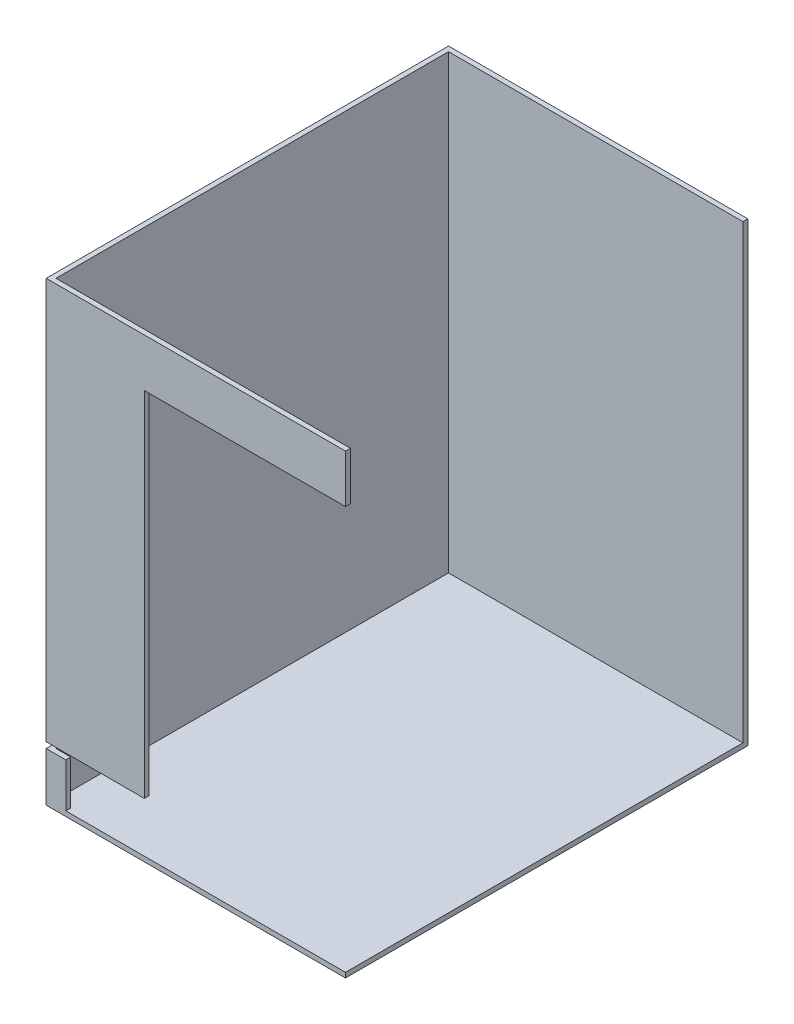
ISO-10303-21;
HEADER;
FILE_DESCRIPTION(('STEP AP214'),'2;1');
FILE_NAME('part.step','',(''),(''),'','','');
FILE_SCHEMA(('AUTOMOTIVE_DESIGN { 1 0 10303 214 1 1 1 1 }'));
ENDSEC;
DATA;
#1=APPLICATION_CONTEXT('core data for automotive mechanical design processes');
#2=APPLICATION_PROTOCOL_DEFINITION('international standard','automotive_design',2000,#1);
#3=PRODUCT_CONTEXT('',#1,'mechanical');
#4=PRODUCT('Part','Part','',(#3));
#5=PRODUCT_RELATED_PRODUCT_CATEGORY('part','',(#4));
#6=PRODUCT_DEFINITION_FORMATION('','',#4);
#7=PRODUCT_DEFINITION_CONTEXT('part definition',#1,'design');
#8=PRODUCT_DEFINITION('design','',#6,#7);
#9=PRODUCT_DEFINITION_SHAPE('','',#8);
#10=(LENGTH_UNIT() NAMED_UNIT(*) SI_UNIT(.MILLI.,.METRE.));
#11=(NAMED_UNIT(*) PLANE_ANGLE_UNIT() SI_UNIT($,.RADIAN.));
#12=(NAMED_UNIT(*) SI_UNIT($,.STERADIAN.) SOLID_ANGLE_UNIT());
#13=UNCERTAINTY_MEASURE_WITH_UNIT(LENGTH_MEASURE(1.E-05),#10,'distance_accuracy_value','');
#14=(GEOMETRIC_REPRESENTATION_CONTEXT(3) GLOBAL_UNCERTAINTY_ASSIGNED_CONTEXT((#13)) GLOBAL_UNIT_ASSIGNED_CONTEXT((#10,
#11,#12)) REPRESENTATION_CONTEXT('',''));
#15=CARTESIAN_POINT('',(0.,0.,0.));
#16=DIRECTION('',(0.,0.,1.));
#17=DIRECTION('',(1.,0.,0.));
#18=AXIS2_PLACEMENT_3D('',#15,#16,#17);
#19=CARTESIAN_POINT('',(0.,230.,202.5));
#20=DIRECTION('',(0.,0.,-1.));
#21=DIRECTION('',(-1.,0.,0.));
#22=AXIS2_PLACEMENT_3D('',#19,#20,#21);
#23=PLANE('',#22);
#24=DIRECTION('',(0.,-1.,0.));
#25=VECTOR('',#24,1.);
#26=CARTESIAN_POINT('',(-2.49999999999998,230.,202.5));
#27=LINE('',#26,#25);
#28=CARTESIAN_POINT('',(-2.49999999999998,230.,202.5));
#29=VERTEX_POINT('',#28);
#30=CARTESIAN_POINT('',(-2.49999999999998,25.5,202.5));
#31=VERTEX_POINT('',#30);
#32=EDGE_CURVE('E282',#29,#31,#27,.T.);
#33=ORIENTED_EDGE('',*,*,#32,.T.);
#34=DIRECTION('',(-1.,0.,0.));
#35=VECTOR('',#34,1.);
#36=CARTESIAN_POINT('',(-2.49999999999998,25.5,202.5));
#37=LINE('',#36,#35);
#38=CARTESIAN_POINT('',(47.5,25.5,202.5));
#39=VERTEX_POINT('',#38);
#40=EDGE_CURVE('E196',#39,#31,#37,.T.);
#41=ORIENTED_EDGE('',*,*,#40,.F.);
#42=DIRECTION('',(0.,-1.,0.));
#43=VECTOR('',#42,1.);
#44=CARTESIAN_POINT('',(47.5,25.5,202.5));
#45=LINE('',#44,#43);
#46=CARTESIAN_POINT('',(47.5,205.5,202.5));
#47=VERTEX_POINT('',#46);
#48=EDGE_CURVE('E210',#47,#39,#45,.T.);
#49=ORIENTED_EDGE('',*,*,#48,.F.);
#50=DIRECTION('',(-1.,0.,0.));
#51=VECTOR('',#50,1.);
#52=CARTESIAN_POINT('',(47.5,205.5,202.5));
#53=LINE('',#52,#51);
#54=CARTESIAN_POINT('',(150.,205.5,202.5));
#55=VERTEX_POINT('',#54);
#56=EDGE_CURVE('E206',#55,#47,#53,.T.);
#57=ORIENTED_EDGE('',*,*,#56,.F.);
#58=DIRECTION('',(0.,-1.,0.));
#59=VECTOR('',#58,1.);
#60=CARTESIAN_POINT('',(150.,230.,202.5));
#61=LINE('',#60,#59);
#62=CARTESIAN_POINT('',(150.,230.,202.5));
#63=VERTEX_POINT('',#62);
#64=EDGE_CURVE('E306',#63,#55,#61,.T.);
#65=ORIENTED_EDGE('',*,*,#64,.F.);
#66=DIRECTION('',(1.,0.,0.));
#67=VECTOR('',#66,1.);
#68=CARTESIAN_POINT('',(0.,230.,202.5));
#69=LINE('',#68,#67);
#70=EDGE_CURVE('E303',#29,#63,#69,.T.);
#71=ORIENTED_EDGE('',*,*,#70,.F.);
#72=EDGE_LOOP('',(#33,#41,#49,#57,#65,#71));
#73=FACE_BOUND('',#72,.T.);
#74=ADVANCED_FACE('F41',(#73),#23,.F.);
#75=CARTESIAN_POINT('',(150.,230.,0.));
#76=DIRECTION('',(-1.,0.,0.));
#77=DIRECTION('',(0.,0.,1.));
#78=AXIS2_PLACEMENT_3D('',#75,#76,#77);
#79=PLANE('',#78);
#80=ORIENTED_EDGE('',*,*,#64,.T.);
#81=DIRECTION('',(0.,0.,1.));
#82=VECTOR('',#81,1.);
#83=CARTESIAN_POINT('',(150.,205.5,199.5));
#84=LINE('',#83,#82);
#85=CARTESIAN_POINT('',(150.,205.5,200.));
#86=VERTEX_POINT('',#85);
#87=EDGE_CURVE('E227',#86,#55,#84,.T.);
#88=ORIENTED_EDGE('',*,*,#87,.F.);
#89=DIRECTION('',(0.,-1.,0.));
#90=VECTOR('',#89,1.);
#91=CARTESIAN_POINT('',(150.,230.,200.));
#92=LINE('',#91,#90);
#93=CARTESIAN_POINT('',(150.,230.,200.));
#94=VERTEX_POINT('',#93);
#95=EDGE_CURVE('E262',#94,#86,#92,.T.);
#96=ORIENTED_EDGE('',*,*,#95,.F.);
#97=DIRECTION('',(0.,0.,-1.));
#98=VECTOR('',#97,1.);
#99=CARTESIAN_POINT('',(150.,230.,0.));
#100=LINE('',#99,#98);
#101=EDGE_CURVE('E272',#63,#94,#100,.T.);
#102=ORIENTED_EDGE('',*,*,#101,.F.);
#103=EDGE_LOOP('',(#80,#88,#96,#102));
#104=FACE_BOUND('',#103,.T.);
#105=ADVANCED_FACE('F383',(#104),#79,.F.);
#106=CARTESIAN_POINT('',(0.,230.,200.));
#107=DIRECTION('',(0.,0.,-1.));
#108=DIRECTION('',(-1.,0.,0.));
#109=AXIS2_PLACEMENT_3D('',#106,#107,#108);
#110=PLANE('',#109);
#111=DIRECTION('',(1.,0.,0.));
#112=VECTOR('',#111,1.);
#113=CARTESIAN_POINT('',(0.,25.5,200.));
#114=LINE('',#113,#112);
#115=CARTESIAN_POINT('',(0.,25.5,200.));
#116=VERTEX_POINT('',#115);
#117=CARTESIAN_POINT('',(47.5,25.5,200.));
#118=VERTEX_POINT('',#117);
#119=EDGE_CURVE('E325',#116,#118,#114,.T.);
#120=ORIENTED_EDGE('',*,*,#119,.F.);
#121=DIRECTION('',(0.,-1.,0.));
#122=VECTOR('',#121,1.);
#123=CARTESIAN_POINT('',(0.,230.,200.));
#124=LINE('',#123,#122);
#125=CARTESIAN_POINT('',(0.,230.,200.));
#126=VERTEX_POINT('',#125);
#127=EDGE_CURVE('E267',#126,#116,#124,.T.);
#128=ORIENTED_EDGE('',*,*,#127,.F.);
#129=DIRECTION('',(1.,0.,0.));
#130=VECTOR('',#129,1.);
#131=CARTESIAN_POINT('',(0.,230.,200.));
#132=LINE('',#131,#130);
#133=EDGE_CURVE('E241',#126,#94,#132,.T.);
#134=ORIENTED_EDGE('',*,*,#133,.T.);
#135=ORIENTED_EDGE('',*,*,#95,.T.);
#136=DIRECTION('',(1.,0.,0.));
#137=VECTOR('',#136,1.);
#138=CARTESIAN_POINT('',(0.,205.5,200.));
#139=LINE('',#138,#137);
#140=CARTESIAN_POINT('',(47.5,205.5,200.));
#141=VERTEX_POINT('',#140);
#142=EDGE_CURVE('E319',#141,#86,#139,.T.);
#143=ORIENTED_EDGE('',*,*,#142,.F.);
#144=DIRECTION('',(0.,1.,0.));
#145=VECTOR('',#144,1.);
#146=CARTESIAN_POINT('',(47.5,230.,200.));
#147=LINE('',#146,#145);
#148=EDGE_CURVE('E322',#118,#141,#147,.T.);
#149=ORIENTED_EDGE('',*,*,#148,.F.);
#150=EDGE_LOOP('',(#120,#128,#134,#135,#143,#149));
#151=FACE_BOUND('',#150,.T.);
#152=ADVANCED_FACE('F375',(#151),#110,.T.);
#153=CARTESIAN_POINT('',(-2.5,230.,0.));
#154=DIRECTION('',(1.,0.,0.));
#155=DIRECTION('',(0.,0.,-1.));
#156=AXIS2_PLACEMENT_3D('',#153,#154,#155);
#157=PLANE('',#156);
#158=DIRECTION('',(0.,-1.,0.));
#159=VECTOR('',#158,1.);
#160=CARTESIAN_POINT('',(-2.49999999999998,25.5,199.5));
#161=LINE('',#160,#159);
#162=CARTESIAN_POINT('',(-2.49999999999998,25.5,199.5));
#163=VERTEX_POINT('',#162);
#164=CARTESIAN_POINT('',(-2.49999999999998,22.5,199.5));
#165=VERTEX_POINT('',#164);
#166=EDGE_CURVE('E191',#163,#165,#161,.T.);
#167=ORIENTED_EDGE('',*,*,#166,.F.);
#168=DIRECTION('',(0.,0.,1.));
#169=VECTOR('',#168,1.);
#170=CARTESIAN_POINT('',(-2.49999999999998,25.5,199.5));
#171=LINE('',#170,#169);
#172=EDGE_CURVE('E216',#163,#31,#171,.T.);
#173=ORIENTED_EDGE('',*,*,#172,.T.);
#174=ORIENTED_EDGE('',*,*,#32,.F.);
#175=DIRECTION('',(0.,0.,1.));
#176=VECTOR('',#175,1.);
#177=CARTESIAN_POINT('',(-2.5,230.,0.));
#178=LINE('',#177,#176);
#179=CARTESIAN_POINT('',(-2.5,230.,-2.5));
#180=VERTEX_POINT('',#179);
#181=EDGE_CURVE('E299',#180,#29,#178,.T.);
#182=ORIENTED_EDGE('',*,*,#181,.F.);
#183=DIRECTION('',(0.,-1.,0.));
#184=VECTOR('',#183,1.);
#185=CARTESIAN_POINT('',(-2.5,230.,-2.5));
#186=LINE('',#185,#184);
#187=CARTESIAN_POINT('',(-2.5,-2.5,-2.5));
#188=VERTEX_POINT('',#187);
#189=EDGE_CURVE('E288',#180,#188,#186,.T.);
#190=ORIENTED_EDGE('',*,*,#189,.T.);
#191=DIRECTION('',(0.,0.,1.));
#192=VECTOR('',#191,1.);
#193=CARTESIAN_POINT('',(-2.5,-2.5,0.));
#194=LINE('',#193,#192);
#195=CARTESIAN_POINT('',(-2.49999999999998,-2.5,202.5));
#196=VERTEX_POINT('',#195);
#197=EDGE_CURVE('E271',#188,#196,#194,.T.);
#198=ORIENTED_EDGE('',*,*,#197,.T.);
#199=CARTESIAN_POINT('',(-2.49999999999998,22.5,202.5));
#200=VERTEX_POINT('',#199);
#201=EDGE_CURVE('E287',#200,#196,#27,.T.);
#202=ORIENTED_EDGE('',*,*,#201,.F.);
#203=DIRECTION('',(0.,0.,1.));
#204=VECTOR('',#203,1.);
#205=CARTESIAN_POINT('',(-2.49999999999998,22.5,199.5));
#206=LINE('',#205,#204);
#207=EDGE_CURVE('E203',#165,#200,#206,.T.);
#208=ORIENTED_EDGE('',*,*,#207,.F.);
#209=EDGE_LOOP('',(#167,#173,#174,#182,#190,#198,#202,#208));
#210=FACE_BOUND('',#209,.T.);
#211=ADVANCED_FACE('F345',(#210),#157,.F.);
#212=DIRECTION('',(1.,0.,0.));
#213=VECTOR('',#212,1.);
#214=CARTESIAN_POINT('',(7.50000000000003,0.,202.5));
#215=LINE('',#214,#213);
#216=CARTESIAN_POINT('',(7.50000000000003,0.,202.5));
#217=VERTEX_POINT('',#216);
#218=CARTESIAN_POINT('',(150.,0.,202.5));
#219=VERTEX_POINT('',#218);
#220=EDGE_CURVE('E165',#217,#219,#215,.T.);
#221=ORIENTED_EDGE('',*,*,#220,.F.);
#222=DIRECTION('',(0.,-1.,0.));
#223=VECTOR('',#222,1.);
#224=CARTESIAN_POINT('',(7.50000000000002,22.5,202.5));
#225=LINE('',#224,#223);
#226=CARTESIAN_POINT('',(7.50000000000002,22.5,202.5));
#227=VERTEX_POINT('',#226);
#228=EDGE_CURVE('E173',#227,#217,#225,.T.);
#229=ORIENTED_EDGE('',*,*,#228,.F.);
#230=DIRECTION('',(1.,0.,0.));
#231=VECTOR('',#230,1.);
#232=CARTESIAN_POINT('',(-2.49999999999998,22.5,202.5));
#233=LINE('',#232,#231);
#234=EDGE_CURVE('E190',#200,#227,#233,.T.);
#235=ORIENTED_EDGE('',*,*,#234,.F.);
#236=ORIENTED_EDGE('',*,*,#201,.T.);
#237=DIRECTION('',(1.,0.,0.));
#238=VECTOR('',#237,1.);
#239=CARTESIAN_POINT('',(0.,-2.5,202.5));
#240=LINE('',#239,#238);
#241=CARTESIAN_POINT('',(150.,-2.5,202.5));
#242=VERTEX_POINT('',#241);
#243=EDGE_CURVE('E281',#196,#242,#240,.T.);
#244=ORIENTED_EDGE('',*,*,#243,.T.);
#245=EDGE_CURVE('E182',#219,#242,#61,.T.);
#246=ORIENTED_EDGE('',*,*,#245,.F.);
#247=EDGE_LOOP('',(#221,#229,#235,#236,#244,#246));
#248=FACE_BOUND('',#247,.T.);
#249=ADVANCED_FACE('F180',(#248),#23,.F.);
#250=DIRECTION('',(0.,0.,-1.));
#251=VECTOR('',#250,1.);
#252=CARTESIAN_POINT('',(150.,0.,0.));
#253=LINE('',#252,#251);
#254=CARTESIAN_POINT('',(150.,0.,0.));
#255=VERTEX_POINT('',#254);
#256=EDGE_CURVE('E253',#219,#255,#253,.T.);
#257=ORIENTED_EDGE('',*,*,#256,.F.);
#258=ORIENTED_EDGE('',*,*,#245,.T.);
#259=DIRECTION('',(0.,0.,-1.));
#260=VECTOR('',#259,1.);
#261=CARTESIAN_POINT('',(150.,-2.5,0.));
#262=LINE('',#261,#260);
#263=CARTESIAN_POINT('',(150.,-2.5,-2.5));
#264=VERTEX_POINT('',#263);
#265=EDGE_CURVE('E295',#242,#264,#262,.T.);
#266=ORIENTED_EDGE('',*,*,#265,.T.);
#267=DIRECTION('',(0.,-1.,0.));
#268=VECTOR('',#267,1.);
#269=CARTESIAN_POINT('',(150.,230.,-2.5));
#270=LINE('',#269,#268);
#271=CARTESIAN_POINT('',(150.,230.,-2.5));
#272=VERTEX_POINT('',#271);
#273=EDGE_CURVE('E292',#272,#264,#270,.T.);
#274=ORIENTED_EDGE('',*,*,#273,.F.);
#275=CARTESIAN_POINT('',(150.,230.,0.));
#276=VERTEX_POINT('',#275);
#277=EDGE_CURVE('E277',#276,#272,#100,.T.);
#278=ORIENTED_EDGE('',*,*,#277,.F.);
#279=DIRECTION('',(0.,-1.,0.));
#280=VECTOR('',#279,1.);
#281=CARTESIAN_POINT('',(150.,230.,0.));
#282=LINE('',#281,#280);
#283=EDGE_CURVE('E64',#276,#255,#282,.T.);
#284=ORIENTED_EDGE('',*,*,#283,.T.);
#285=EDGE_LOOP('',(#257,#258,#266,#274,#278,#284));
#286=FACE_BOUND('',#285,.T.);
#287=ADVANCED_FACE('F363',(#286),#79,.F.);
#288=CARTESIAN_POINT('',(0.,230.,-2.5));
#289=DIRECTION('',(0.,0.,1.));
#290=DIRECTION('',(1.,0.,0.));
#291=AXIS2_PLACEMENT_3D('',#288,#289,#290);
#292=PLANE('',#291);
#293=DIRECTION('',(-1.,0.,0.));
#294=VECTOR('',#293,1.);
#295=CARTESIAN_POINT('',(0.,-2.5,-2.5));
#296=LINE('',#295,#294);
#297=EDGE_CURVE('E296',#264,#188,#296,.T.);
#298=ORIENTED_EDGE('',*,*,#297,.T.);
#299=ORIENTED_EDGE('',*,*,#189,.F.);
#300=DIRECTION('',(-1.,0.,0.));
#301=VECTOR('',#300,1.);
#302=CARTESIAN_POINT('',(0.,230.,-2.5));
#303=LINE('',#302,#301);
#304=EDGE_CURVE('E276',#272,#180,#303,.T.);
#305=ORIENTED_EDGE('',*,*,#304,.F.);
#306=ORIENTED_EDGE('',*,*,#273,.T.);
#307=EDGE_LOOP('',(#298,#299,#305,#306));
#308=FACE_BOUND('',#307,.T.);
#309=ADVANCED_FACE('F359',(#308),#292,.F.);
#310=CARTESIAN_POINT('',(0.,230.,0.));
#311=DIRECTION('',(0.,1.,0.));
#312=DIRECTION('',(0.,0.,1.));
#313=AXIS2_PLACEMENT_3D('',#310,#311,#312);
#314=PLANE('',#313);
#315=ORIENTED_EDGE('',*,*,#133,.F.);
#316=DIRECTION('',(0.,0.,1.));
#317=VECTOR('',#316,1.);
#318=CARTESIAN_POINT('',(0.,230.,0.));
#319=LINE('',#318,#317);
#320=CARTESIAN_POINT('',(0.,230.,0.));
#321=VERTEX_POINT('',#320);
#322=EDGE_CURVE('E238',#321,#126,#319,.T.);
#323=ORIENTED_EDGE('',*,*,#322,.F.);
#324=DIRECTION('',(-1.,0.,0.));
#325=VECTOR('',#324,1.);
#326=CARTESIAN_POINT('',(0.,230.,0.));
#327=LINE('',#326,#325);
#328=EDGE_CURVE('E245',#276,#321,#327,.T.);
#329=ORIENTED_EDGE('',*,*,#328,.F.);
#330=ORIENTED_EDGE('',*,*,#277,.T.);
#331=ORIENTED_EDGE('',*,*,#304,.T.);
#332=ORIENTED_EDGE('',*,*,#181,.T.);
#333=ORIENTED_EDGE('',*,*,#70,.T.);
#334=ORIENTED_EDGE('',*,*,#101,.T.);
#335=EDGE_LOOP('',(#315,#323,#329,#330,#331,#332,#333,#334));
#336=FACE_BOUND('',#335,.T.);
#337=ADVANCED_FACE('F402',(#336),#314,.T.);
#338=CARTESIAN_POINT('',(0.,-2.5,0.));
#339=DIRECTION('',(0.,1.,0.));
#340=DIRECTION('',(0.,0.,1.));
#341=AXIS2_PLACEMENT_3D('',#338,#339,#340);
#342=PLANE('',#341);
#343=ORIENTED_EDGE('',*,*,#197,.F.);
#344=ORIENTED_EDGE('',*,*,#297,.F.);
#345=ORIENTED_EDGE('',*,*,#265,.F.);
#346=ORIENTED_EDGE('',*,*,#243,.F.);
#347=EDGE_LOOP('',(#343,#344,#345,#346));
#348=FACE_BOUND('',#347,.T.);
#349=ADVANCED_FACE('F43',(#348),#342,.F.);
#350=CARTESIAN_POINT('',(0.,230.,0.));
#351=DIRECTION('',(1.,0.,0.));
#352=DIRECTION('',(0.,0.,-1.));
#353=AXIS2_PLACEMENT_3D('',#350,#351,#352);
#354=PLANE('',#353);
#355=DIRECTION('',(0.,0.,1.));
#356=VECTOR('',#355,1.);
#357=CARTESIAN_POINT('',(0.,25.5,0.));
#358=LINE('',#357,#356);
#359=CARTESIAN_POINT('',(0.,25.5,199.5));
#360=VERTEX_POINT('',#359);
#361=EDGE_CURVE('E234',#360,#116,#358,.T.);
#362=ORIENTED_EDGE('',*,*,#361,.F.);
#363=DIRECTION('',(0.,-1.,0.));
#364=VECTOR('',#363,1.);
#365=CARTESIAN_POINT('',(0.,230.,199.5));
#366=LINE('',#365,#364);
#367=CARTESIAN_POINT('',(0.,22.5,199.5));
#368=VERTEX_POINT('',#367);
#369=EDGE_CURVE('E50',#360,#368,#366,.T.);
#370=ORIENTED_EDGE('',*,*,#369,.T.);
#371=DIRECTION('',(0.,0.,-1.));
#372=VECTOR('',#371,1.);
#373=CARTESIAN_POINT('',(0.,22.5,0.));
#374=LINE('',#373,#372);
#375=CARTESIAN_POINT('',(0.,22.5,200.));
#376=VERTEX_POINT('',#375);
#377=EDGE_CURVE('E220',#376,#368,#374,.T.);
#378=ORIENTED_EDGE('',*,*,#377,.F.);
#379=CARTESIAN_POINT('',(0.,0.,200.));
#380=VERTEX_POINT('',#379);
#381=EDGE_CURVE('E266',#376,#380,#124,.T.);
#382=ORIENTED_EDGE('',*,*,#381,.T.);
#383=DIRECTION('',(0.,0.,1.));
#384=VECTOR('',#383,1.);
#385=CARTESIAN_POINT('',(0.,0.,0.));
#386=LINE('',#385,#384);
#387=CARTESIAN_POINT('',(0.,0.,0.));
#388=VERTEX_POINT('',#387);
#389=EDGE_CURVE('E237',#388,#380,#386,.T.);
#390=ORIENTED_EDGE('',*,*,#389,.F.);
#391=DIRECTION('',(0.,-1.,0.));
#392=VECTOR('',#391,1.);
#393=CARTESIAN_POINT('',(0.,230.,0.));
#394=LINE('',#393,#392);
#395=EDGE_CURVE('E248',#321,#388,#394,.T.);
#396=ORIENTED_EDGE('',*,*,#395,.F.);
#397=ORIENTED_EDGE('',*,*,#322,.T.);
#398=ORIENTED_EDGE('',*,*,#127,.T.);
#399=EDGE_LOOP('',(#362,#370,#378,#382,#390,#396,#397,#398));
#400=FACE_BOUND('',#399,.T.);
#401=ADVANCED_FACE('F331',(#400),#354,.T.);
#402=DIRECTION('',(0.,1.,0.));
#403=VECTOR('',#402,1.);
#404=CARTESIAN_POINT('',(7.5,230.,200.));
#405=LINE('',#404,#403);
#406=CARTESIAN_POINT('',(7.50000000000003,0.,200.));
#407=VERTEX_POINT('',#406);
#408=CARTESIAN_POINT('',(7.50000000000002,22.5,200.));
#409=VERTEX_POINT('',#408);
#410=EDGE_CURVE('E57',#407,#409,#405,.T.);
#411=ORIENTED_EDGE('',*,*,#410,.F.);
#412=DIRECTION('',(1.,0.,0.));
#413=VECTOR('',#412,1.);
#414=CARTESIAN_POINT('',(0.,0.,200.));
#415=LINE('',#414,#413);
#416=EDGE_CURVE('E169',#380,#407,#415,.T.);
#417=ORIENTED_EDGE('',*,*,#416,.F.);
#418=ORIENTED_EDGE('',*,*,#381,.F.);
#419=DIRECTION('',(-1.,0.,0.));
#420=VECTOR('',#419,1.);
#421=CARTESIAN_POINT('',(0.,22.5,200.));
#422=LINE('',#421,#420);
#423=EDGE_CURVE('E286',#409,#376,#422,.T.);
#424=ORIENTED_EDGE('',*,*,#423,.F.);
#425=EDGE_LOOP('',(#411,#417,#418,#424));
#426=FACE_BOUND('',#425,.T.);
#427=ADVANCED_FACE('F372',(#426),#110,.T.);
#428=CARTESIAN_POINT('',(0.,230.,0.));
#429=DIRECTION('',(0.,0.,1.));
#430=DIRECTION('',(1.,0.,0.));
#431=AXIS2_PLACEMENT_3D('',#428,#429,#430);
#432=PLANE('',#431);
#433=DIRECTION('',(-1.,0.,0.));
#434=VECTOR('',#433,1.);
#435=CARTESIAN_POINT('',(0.,0.,0.));
#436=LINE('',#435,#434);
#437=EDGE_CURVE('E242',#255,#388,#436,.T.);
#438=ORIENTED_EDGE('',*,*,#437,.F.);
#439=ORIENTED_EDGE('',*,*,#283,.F.);
#440=ORIENTED_EDGE('',*,*,#328,.T.);
#441=ORIENTED_EDGE('',*,*,#395,.T.);
#442=EDGE_LOOP('',(#438,#439,#440,#441));
#443=FACE_BOUND('',#442,.T.);
#444=ADVANCED_FACE('F365',(#443),#432,.T.);
#445=CARTESIAN_POINT('',(0.,0.,0.));
#446=DIRECTION('',(0.,1.,0.));
#447=DIRECTION('',(0.,0.,1.));
#448=AXIS2_PLACEMENT_3D('',#445,#446,#447);
#449=PLANE('',#448);
#450=ORIENTED_EDGE('',*,*,#416,.T.);
#451=DIRECTION('',(0.,0.,1.));
#452=VECTOR('',#451,1.);
#453=CARTESIAN_POINT('',(7.50000000000003,0.,172.5));
#454=LINE('',#453,#452);
#455=EDGE_CURVE('E161',#407,#217,#454,.T.);
#456=ORIENTED_EDGE('',*,*,#455,.T.);
#457=ORIENTED_EDGE('',*,*,#220,.T.);
#458=ORIENTED_EDGE('',*,*,#256,.T.);
#459=ORIENTED_EDGE('',*,*,#437,.T.);
#460=ORIENTED_EDGE('',*,*,#389,.T.);
#461=EDGE_LOOP('',(#450,#456,#457,#458,#459,#460));
#462=FACE_BOUND('',#461,.T.);
#463=ADVANCED_FACE('F163',(#462),#449,.T.);
#464=CARTESIAN_POINT('',(-2.49999999999998,25.5,199.5));
#465=DIRECTION('',(0.,1.,0.));
#466=DIRECTION('',(0.,0.,1.));
#467=AXIS2_PLACEMENT_3D('',#464,#465,#466);
#468=PLANE('',#467);
#469=ORIENTED_EDGE('',*,*,#361,.T.);
#470=ORIENTED_EDGE('',*,*,#119,.T.);
#471=DIRECTION('',(0.,0.,1.));
#472=VECTOR('',#471,1.);
#473=CARTESIAN_POINT('',(47.5,25.5,199.5));
#474=LINE('',#473,#472);
#475=EDGE_CURVE('E221',#118,#39,#474,.T.);
#476=ORIENTED_EDGE('',*,*,#475,.T.);
#477=ORIENTED_EDGE('',*,*,#40,.T.);
#478=ORIENTED_EDGE('',*,*,#172,.F.);
#479=DIRECTION('',(-1.,0.,0.));
#480=VECTOR('',#479,1.);
#481=CARTESIAN_POINT('',(-2.49999999999998,25.5,199.5));
#482=LINE('',#481,#480);
#483=EDGE_CURVE('E200',#360,#163,#482,.T.);
#484=ORIENTED_EDGE('',*,*,#483,.F.);
#485=EDGE_LOOP('',(#469,#470,#476,#477,#478,#484));
#486=FACE_BOUND('',#485,.T.);
#487=ADVANCED_FACE('F338',(#486),#468,.F.);
#488=CARTESIAN_POINT('',(47.5,25.5,199.5));
#489=DIRECTION('',(-1.,0.,0.));
#490=DIRECTION('',(0.,0.,1.));
#491=AXIS2_PLACEMENT_3D('',#488,#489,#490);
#492=PLANE('',#491);
#493=ORIENTED_EDGE('',*,*,#148,.T.);
#494=DIRECTION('',(0.,0.,1.));
#495=VECTOR('',#494,1.);
#496=CARTESIAN_POINT('',(47.5,205.5,199.5));
#497=LINE('',#496,#495);
#498=EDGE_CURVE('E224',#141,#47,#497,.T.);
#499=ORIENTED_EDGE('',*,*,#498,.T.);
#500=ORIENTED_EDGE('',*,*,#48,.T.);
#501=ORIENTED_EDGE('',*,*,#475,.F.);
#502=EDGE_LOOP('',(#493,#499,#500,#501));
#503=FACE_BOUND('',#502,.T.);
#504=ADVANCED_FACE('F423',(#503),#492,.F.);
#505=CARTESIAN_POINT('',(47.5,205.5,199.5));
#506=DIRECTION('',(0.,1.,0.));
#507=DIRECTION('',(0.,0.,1.));
#508=AXIS2_PLACEMENT_3D('',#505,#506,#507);
#509=PLANE('',#508);
#510=ORIENTED_EDGE('',*,*,#142,.T.);
#511=ORIENTED_EDGE('',*,*,#87,.T.);
#512=ORIENTED_EDGE('',*,*,#56,.T.);
#513=ORIENTED_EDGE('',*,*,#498,.F.);
#514=EDGE_LOOP('',(#510,#511,#512,#513));
#515=FACE_BOUND('',#514,.T.);
#516=ADVANCED_FACE('F418',(#515),#509,.F.);
#517=CARTESIAN_POINT('',(-2.49999999999998,22.5,199.5));
#518=DIRECTION('',(0.,-1.,0.));
#519=DIRECTION('',(1.,0.,0.));
#520=AXIS2_PLACEMENT_3D('',#517,#518,#519);
#521=PLANE('',#520);
#522=ORIENTED_EDGE('',*,*,#234,.T.);
#523=DIRECTION('',(0.,0.,-1.));
#524=VECTOR('',#523,1.);
#525=CARTESIAN_POINT('',(7.50000000000002,22.5,199.5));
#526=LINE('',#525,#524);
#527=EDGE_CURVE('E11',#227,#409,#526,.T.);
#528=ORIENTED_EDGE('',*,*,#527,.T.);
#529=ORIENTED_EDGE('',*,*,#423,.T.);
#530=ORIENTED_EDGE('',*,*,#377,.T.);
#531=DIRECTION('',(1.,0.,0.));
#532=VECTOR('',#531,1.);
#533=CARTESIAN_POINT('',(-2.49999999999998,22.5,199.5));
#534=LINE('',#533,#532);
#535=EDGE_CURVE('E195',#165,#368,#534,.T.);
#536=ORIENTED_EDGE('',*,*,#535,.F.);
#537=ORIENTED_EDGE('',*,*,#207,.T.);
#538=EDGE_LOOP('',(#522,#528,#529,#530,#536,#537));
#539=FACE_BOUND('',#538,.T.);
#540=ADVANCED_FACE('F348',(#539),#521,.F.);
#541=CARTESIAN_POINT('',(0.,0.,199.5));
#542=DIRECTION('',(0.,0.,1.));
#543=DIRECTION('',(1.,0.,0.));
#544=AXIS2_PLACEMENT_3D('',#541,#542,#543);
#545=PLANE('',#544);
#546=ORIENTED_EDGE('',*,*,#483,.T.);
#547=ORIENTED_EDGE('',*,*,#166,.T.);
#548=ORIENTED_EDGE('',*,*,#535,.T.);
#549=ORIENTED_EDGE('',*,*,#369,.F.);
#550=EDGE_LOOP('',(#546,#547,#548,#549));
#551=FACE_BOUND('',#550,.T.);
#552=ADVANCED_FACE('F335',(#551),#545,.T.);
#553=CARTESIAN_POINT('',(7.50000000000002,22.5,172.5));
#554=DIRECTION('',(-1.,0.,0.));
#555=DIRECTION('',(0.,-1.,0.));
#556=AXIS2_PLACEMENT_3D('',#553,#554,#555);
#557=PLANE('',#556);
#558=ORIENTED_EDGE('',*,*,#410,.T.);
#559=ORIENTED_EDGE('',*,*,#527,.F.);
#560=ORIENTED_EDGE('',*,*,#228,.T.);
#561=ORIENTED_EDGE('',*,*,#455,.F.);
#562=EDGE_LOOP('',(#558,#559,#560,#561));
#563=FACE_BOUND('',#562,.T.);
#564=ADVANCED_FACE('F174',(#563),#557,.F.);
#565=CLOSED_SHELL('',(#74,#105,#152,#211,#249,#287,#309,#337,#349,#401,#427,#444,#463,#487,#504,
#516,#540,#552,#564));
#566=MANIFOLD_SOLID_BREP('B2',#565);
#567=ADVANCED_BREP_SHAPE_REPRESENTATION('',(#18,#566),#14);
#568=SHAPE_DEFINITION_REPRESENTATION(#9,#567);
ENDSEC;
END-ISO-10303-21;
